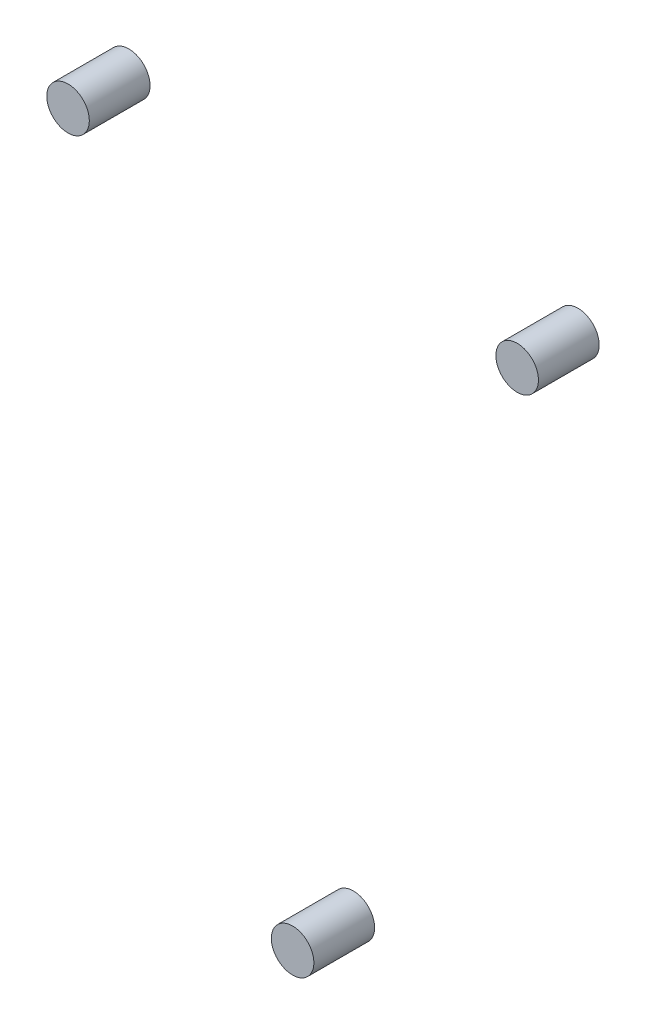
ISO-10303-21;
HEADER;
FILE_DESCRIPTION(('STEP AP214'),'2;1');
FILE_NAME('part.step','',(''),(''),'','','');
FILE_SCHEMA(('AUTOMOTIVE_DESIGN { 1 0 10303 214 1 1 1 1 }'));
ENDSEC;
DATA;
#1=APPLICATION_CONTEXT('core data for automotive mechanical design processes');
#2=APPLICATION_PROTOCOL_DEFINITION('international standard','automotive_design',2000,#1);
#3=PRODUCT_CONTEXT('',#1,'mechanical');
#4=PRODUCT('Part','Part','',(#3));
#5=PRODUCT_RELATED_PRODUCT_CATEGORY('part','',(#4));
#6=PRODUCT_DEFINITION_FORMATION('','',#4);
#7=PRODUCT_DEFINITION_CONTEXT('part definition',#1,'design');
#8=PRODUCT_DEFINITION('design','',#6,#7);
#9=PRODUCT_DEFINITION_SHAPE('','',#8);
#10=(LENGTH_UNIT() NAMED_UNIT(*) SI_UNIT(.MILLI.,.METRE.));
#11=(NAMED_UNIT(*) PLANE_ANGLE_UNIT() SI_UNIT($,.RADIAN.));
#12=(NAMED_UNIT(*) SI_UNIT($,.STERADIAN.) SOLID_ANGLE_UNIT());
#13=UNCERTAINTY_MEASURE_WITH_UNIT(LENGTH_MEASURE(1.E-05),#10,'distance_accuracy_value','');
#14=(GEOMETRIC_REPRESENTATION_CONTEXT(3) GLOBAL_UNCERTAINTY_ASSIGNED_CONTEXT((#13)) GLOBAL_UNIT_ASSIGNED_CONTEXT((#10,
#11,#12)) REPRESENTATION_CONTEXT('',''));
#15=CARTESIAN_POINT('',(0.,0.,0.));
#16=DIRECTION('',(0.,0.,1.));
#17=DIRECTION('',(1.,0.,0.));
#18=AXIS2_PLACEMENT_3D('',#15,#16,#17);
#19=CARTESIAN_POINT('',(36.9602875569758,44.0475554793414,10.));
#20=DIRECTION('',(0.,0.,-1.));
#21=DIRECTION('',(-1.,0.,0.));
#22=AXIS2_PLACEMENT_3D('',#19,#20,#21);
#23=CYLINDRICAL_SURFACE('',#22,3.5);
#24=CARTESIAN_POINT('',(36.9602875569758,44.0475554793414,10.));
#25=DIRECTION('',(0.,0.,1.));
#26=DIRECTION('',(1.,0.,0.));
#27=AXIS2_PLACEMENT_3D('',#24,#25,#26);
#28=CIRCLE('',#27,3.5);
#29=CARTESIAN_POINT('',(40.4602875569758,44.0475554793414,10.));
#30=VERTEX_POINT('',#29);
#31=EDGE_CURVE('E11',#30,#30,#28,.T.);
#32=ORIENTED_EDGE('',*,*,#31,.F.);
#33=EDGE_LOOP('',(#32));
#34=FACE_BOUND('',#33,.T.);
#35=CARTESIAN_POINT('',(36.9602875569758,44.0475554793414,0.));
#36=DIRECTION('',(0.,0.,1.));
#37=DIRECTION('',(1.,0.,0.));
#38=AXIS2_PLACEMENT_3D('',#35,#36,#37);
#39=CIRCLE('',#38,3.5);
#40=CARTESIAN_POINT('',(40.4602875569758,44.0475554793414,0.));
#41=VERTEX_POINT('',#40);
#42=EDGE_CURVE('E49',#41,#41,#39,.T.);
#43=ORIENTED_EDGE('',*,*,#42,.T.);
#44=EDGE_LOOP('',(#43));
#45=FACE_BOUND('',#44,.T.);
#46=ADVANCED_FACE('F46',(#34,#45),#23,.T.);
#47=CARTESIAN_POINT('',(36.9602875569758,44.0475554793414,10.));
#48=DIRECTION('',(0.,0.,1.));
#49=DIRECTION('',(1.,0.,0.));
#50=AXIS2_PLACEMENT_3D('',#47,#48,#49);
#51=PLANE('',#50);
#52=ORIENTED_EDGE('',*,*,#31,.T.);
#53=EDGE_LOOP('',(#52));
#54=FACE_BOUND('',#53,.T.);
#55=ADVANCED_FACE('F61',(#54),#51,.T.);
#56=CARTESIAN_POINT('',(36.9602875569758,44.0475554793414,0.));
#57=DIRECTION('',(0.,0.,1.));
#58=DIRECTION('',(1.,0.,0.));
#59=AXIS2_PLACEMENT_3D('',#56,#57,#58);
#60=PLANE('',#59);
#61=ORIENTED_EDGE('',*,*,#42,.F.);
#62=EDGE_LOOP('',(#61));
#63=FACE_BOUND('',#62,.T.);
#64=ADVANCED_FACE('F59',(#63),#60,.F.);
#65=CLOSED_SHELL('',(#46,#55,#64));
#66=MANIFOLD_SOLID_BREP('B2',#65);
#67=CARTESIAN_POINT('',(-36.9602875569758,44.0475554793414,10.));
#68=DIRECTION('',(0.,0.,-1.));
#69=DIRECTION('',(-1.,0.,0.));
#70=AXIS2_PLACEMENT_3D('',#67,#68,#69);
#71=CYLINDRICAL_SURFACE('',#70,3.5);
#72=CARTESIAN_POINT('',(-36.9602875569758,44.0475554793414,10.));
#73=DIRECTION('',(0.,0.,1.));
#74=DIRECTION('',(1.,0.,0.));
#75=AXIS2_PLACEMENT_3D('',#72,#73,#74);
#76=CIRCLE('',#75,3.5);
#77=CARTESIAN_POINT('',(-33.4602875569758,44.0475554793414,10.));
#78=VERTEX_POINT('',#77);
#79=EDGE_CURVE('E45',#78,#78,#76,.T.);
#80=ORIENTED_EDGE('',*,*,#79,.F.);
#81=EDGE_LOOP('',(#80));
#82=FACE_BOUND('',#81,.T.);
#83=CARTESIAN_POINT('',(-36.9602875569758,44.0475554793414,0.));
#84=DIRECTION('',(0.,0.,1.));
#85=DIRECTION('',(1.,0.,0.));
#86=AXIS2_PLACEMENT_3D('',#83,#84,#85);
#87=CIRCLE('',#86,3.5);
#88=CARTESIAN_POINT('',(-33.4602875569758,44.0475554793414,0.));
#89=VERTEX_POINT('',#88);
#90=EDGE_CURVE('E97',#89,#89,#87,.T.);
#91=ORIENTED_EDGE('',*,*,#90,.T.);
#92=EDGE_LOOP('',(#91));
#93=FACE_BOUND('',#92,.T.);
#94=ADVANCED_FACE('F94',(#82,#93),#71,.T.);
#95=CARTESIAN_POINT('',(-36.9602875569758,44.0475554793414,10.));
#96=DIRECTION('',(0.,0.,1.));
#97=DIRECTION('',(1.,0.,0.));
#98=AXIS2_PLACEMENT_3D('',#95,#96,#97);
#99=PLANE('',#98);
#100=ORIENTED_EDGE('',*,*,#79,.T.);
#101=EDGE_LOOP('',(#100));
#102=FACE_BOUND('',#101,.T.);
#103=ADVANCED_FACE('F109',(#102),#99,.T.);
#104=CARTESIAN_POINT('',(-36.9602875569758,44.0475554793414,0.));
#105=DIRECTION('',(0.,0.,1.));
#106=DIRECTION('',(1.,0.,0.));
#107=AXIS2_PLACEMENT_3D('',#104,#105,#106);
#108=PLANE('',#107);
#109=ORIENTED_EDGE('',*,*,#90,.F.);
#110=EDGE_LOOP('',(#109));
#111=FACE_BOUND('',#110,.T.);
#112=ADVANCED_FACE('F107',(#111),#108,.F.);
#113=CLOSED_SHELL('',(#94,#103,#112));
#114=MANIFOLD_SOLID_BREP('B6',#113);
#115=CARTESIAN_POINT('',(0.,-57.5,10.));
#116=DIRECTION('',(0.,0.,-1.));
#117=DIRECTION('',(-1.,0.,0.));
#118=AXIS2_PLACEMENT_3D('',#115,#116,#117);
#119=CYLINDRICAL_SURFACE('',#118,3.5);
#120=CARTESIAN_POINT('',(0.,-57.5,10.));
#121=DIRECTION('',(0.,0.,1.));
#122=DIRECTION('',(1.,0.,0.));
#123=AXIS2_PLACEMENT_3D('',#120,#121,#122);
#124=CIRCLE('',#123,3.5);
#125=CARTESIAN_POINT('',(3.5,-57.5,10.));
#126=VERTEX_POINT('',#125);
#127=EDGE_CURVE('E93',#126,#126,#124,.T.);
#128=ORIENTED_EDGE('',*,*,#127,.F.);
#129=EDGE_LOOP('',(#128));
#130=FACE_BOUND('',#129,.T.);
#131=CARTESIAN_POINT('',(0.,-57.5,0.));
#132=DIRECTION('',(0.,0.,1.));
#133=DIRECTION('',(1.,0.,0.));
#134=AXIS2_PLACEMENT_3D('',#131,#132,#133);
#135=CIRCLE('',#134,3.5);
#136=CARTESIAN_POINT('',(3.5,-57.5,0.));
#137=VERTEX_POINT('',#136);
#138=EDGE_CURVE('E138',#137,#137,#135,.T.);
#139=ORIENTED_EDGE('',*,*,#138,.T.);
#140=EDGE_LOOP('',(#139));
#141=FACE_BOUND('',#140,.T.);
#142=ADVANCED_FACE('F135',(#130,#141),#119,.T.);
#143=CARTESIAN_POINT('',(0.,-57.5,10.));
#144=DIRECTION('',(0.,0.,1.));
#145=DIRECTION('',(1.,0.,0.));
#146=AXIS2_PLACEMENT_3D('',#143,#144,#145);
#147=PLANE('',#146);
#148=ORIENTED_EDGE('',*,*,#127,.T.);
#149=EDGE_LOOP('',(#148));
#150=FACE_BOUND('',#149,.T.);
#151=ADVANCED_FACE('F152',(#150),#147,.T.);
#152=CARTESIAN_POINT('',(0.,-57.5,0.));
#153=DIRECTION('',(0.,0.,1.));
#154=DIRECTION('',(1.,0.,0.));
#155=AXIS2_PLACEMENT_3D('',#152,#153,#154);
#156=PLANE('',#155);
#157=ORIENTED_EDGE('',*,*,#138,.F.);
#158=EDGE_LOOP('',(#157));
#159=FACE_BOUND('',#158,.T.);
#160=ADVANCED_FACE('F150',(#159),#156,.F.);
#161=CLOSED_SHELL('',(#142,#151,#160));
#162=MANIFOLD_SOLID_BREP('B40',#161);
#163=ADVANCED_BREP_SHAPE_REPRESENTATION('',(#18,#66,#114,#162),#14);
#164=SHAPE_DEFINITION_REPRESENTATION(#9,#163);
ENDSEC;
END-ISO-10303-21;
